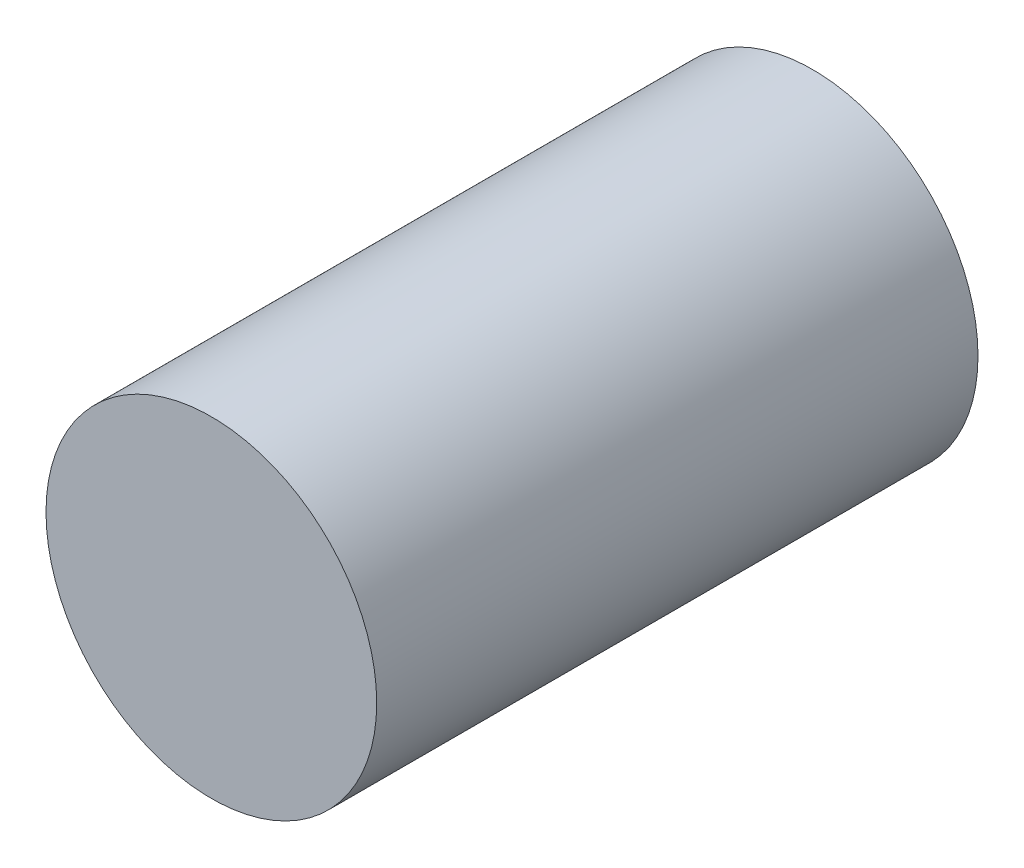
ISO-10303-21;
HEADER;
FILE_DESCRIPTION(('STEP AP214'),'2;1');
FILE_NAME('part.step','',(''),(''),'','','');
FILE_SCHEMA(('AUTOMOTIVE_DESIGN { 1 0 10303 214 1 1 1 1 }'));
ENDSEC;
DATA;
#1=APPLICATION_CONTEXT('core data for automotive mechanical design processes');
#2=APPLICATION_PROTOCOL_DEFINITION('international standard','automotive_design',2000,#1);
#3=PRODUCT_CONTEXT('',#1,'mechanical');
#4=PRODUCT('Part','Part','',(#3));
#5=PRODUCT_RELATED_PRODUCT_CATEGORY('part','',(#4));
#6=PRODUCT_DEFINITION_FORMATION('','',#4);
#7=PRODUCT_DEFINITION_CONTEXT('part definition',#1,'design');
#8=PRODUCT_DEFINITION('design','',#6,#7);
#9=PRODUCT_DEFINITION_SHAPE('','',#8);
#10=(LENGTH_UNIT() NAMED_UNIT(*) SI_UNIT(.MILLI.,.METRE.));
#11=(NAMED_UNIT(*) PLANE_ANGLE_UNIT() SI_UNIT($,.RADIAN.));
#12=(NAMED_UNIT(*) SI_UNIT($,.STERADIAN.) SOLID_ANGLE_UNIT());
#13=UNCERTAINTY_MEASURE_WITH_UNIT(LENGTH_MEASURE(1.E-05),#10,'distance_accuracy_value','');
#14=(GEOMETRIC_REPRESENTATION_CONTEXT(3) GLOBAL_UNCERTAINTY_ASSIGNED_CONTEXT((#13)) GLOBAL_UNIT_ASSIGNED_CONTEXT((#10,
#11,#12)) REPRESENTATION_CONTEXT('',''));
#15=CARTESIAN_POINT('',(0.,0.,0.));
#16=DIRECTION('',(0.,0.,1.));
#17=DIRECTION('',(1.,0.,0.));
#18=AXIS2_PLACEMENT_3D('',#15,#16,#17);
#19=CARTESIAN_POINT('',(0.,0.,6.));
#20=DIRECTION('',(0.,0.,-1.));
#21=DIRECTION('',(-1.,0.,0.));
#22=AXIS2_PLACEMENT_3D('',#19,#20,#21);
#23=CYLINDRICAL_SURFACE('',#22,1.65);
#24=CARTESIAN_POINT('',(0.,0.,6.));
#25=DIRECTION('',(0.,0.,1.));
#26=DIRECTION('',(1.,0.,0.));
#27=AXIS2_PLACEMENT_3D('',#24,#25,#26);
#28=CIRCLE('',#27,1.65);
#29=CARTESIAN_POINT('',(1.65,0.,6.));
#30=VERTEX_POINT('',#29);
#31=EDGE_CURVE('E10',#30,#30,#28,.T.);
#32=ORIENTED_EDGE('',*,*,#31,.F.);
#33=EDGE_LOOP('',(#32));
#34=FACE_BOUND('',#33,.T.);
#35=CARTESIAN_POINT('',(0.,0.,0.));
#36=DIRECTION('',(0.,0.,1.));
#37=DIRECTION('',(1.,0.,0.));
#38=AXIS2_PLACEMENT_3D('',#35,#36,#37);
#39=CIRCLE('',#38,1.65);
#40=CARTESIAN_POINT('',(1.65,0.,0.));
#41=VERTEX_POINT('',#40);
#42=EDGE_CURVE('E37',#41,#41,#39,.T.);
#43=ORIENTED_EDGE('',*,*,#42,.T.);
#44=EDGE_LOOP('',(#43));
#45=FACE_BOUND('',#44,.T.);
#46=ADVANCED_FACE('F40',(#34,#45),#23,.T.);
#47=CARTESIAN_POINT('',(0.,0.,6.));
#48=DIRECTION('',(0.,0.,1.));
#49=DIRECTION('',(1.,0.,0.));
#50=AXIS2_PLACEMENT_3D('',#47,#48,#49);
#51=PLANE('',#50);
#52=ORIENTED_EDGE('',*,*,#31,.T.);
#53=EDGE_LOOP('',(#52));
#54=FACE_BOUND('',#53,.T.);
#55=ADVANCED_FACE('F55',(#54),#51,.T.);
#56=CARTESIAN_POINT('',(0.,0.,0.));
#57=DIRECTION('',(0.,0.,1.));
#58=DIRECTION('',(1.,0.,0.));
#59=AXIS2_PLACEMENT_3D('',#56,#57,#58);
#60=PLANE('',#59);
#61=ORIENTED_EDGE('',*,*,#42,.F.);
#62=EDGE_LOOP('',(#61));
#63=FACE_BOUND('',#62,.T.);
#64=ADVANCED_FACE('F49',(#63),#60,.F.);
#65=CLOSED_SHELL('',(#46,#55,#64));
#66=MANIFOLD_SOLID_BREP('B2',#65);
#67=ADVANCED_BREP_SHAPE_REPRESENTATION('',(#18,#66),#14);
#68=SHAPE_DEFINITION_REPRESENTATION(#9,#67);
ENDSEC;
END-ISO-10303-21;
